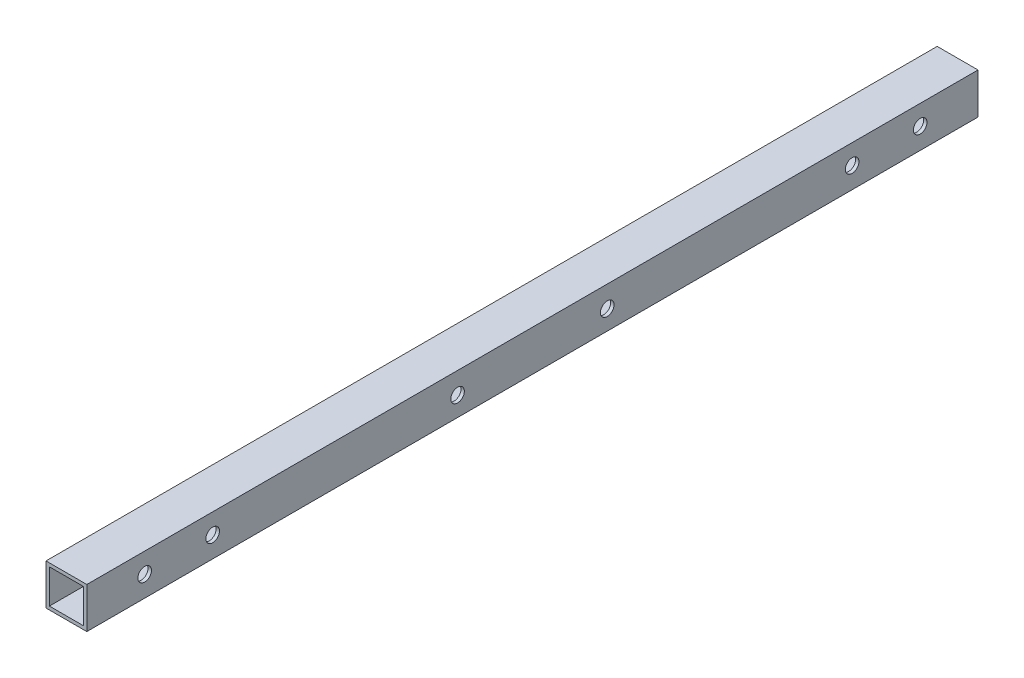
ISO-10303-21;
HEADER;
FILE_DESCRIPTION(('STEP AP214'),'2;1');
FILE_NAME('part.step','',(''),(''),'','','');
FILE_SCHEMA(('AUTOMOTIVE_DESIGN { 1 0 10303 214 1 1 1 1 }'));
ENDSEC;
DATA;
#1=APPLICATION_CONTEXT('core data for automotive mechanical design processes');
#2=APPLICATION_PROTOCOL_DEFINITION('international standard','automotive_design',2000,#1);
#3=PRODUCT_CONTEXT('',#1,'mechanical');
#4=PRODUCT('Part','Part','',(#3));
#5=PRODUCT_RELATED_PRODUCT_CATEGORY('part','',(#4));
#6=PRODUCT_DEFINITION_FORMATION('','',#4);
#7=PRODUCT_DEFINITION_CONTEXT('part definition',#1,'design');
#8=PRODUCT_DEFINITION('design','',#6,#7);
#9=PRODUCT_DEFINITION_SHAPE('','',#8);
#10=(LENGTH_UNIT() NAMED_UNIT(*) SI_UNIT(.MILLI.,.METRE.));
#11=(NAMED_UNIT(*) PLANE_ANGLE_UNIT() SI_UNIT($,.RADIAN.));
#12=(NAMED_UNIT(*) SI_UNIT($,.STERADIAN.) SOLID_ANGLE_UNIT());
#13=UNCERTAINTY_MEASURE_WITH_UNIT(LENGTH_MEASURE(1.E-05),#10,'distance_accuracy_value','');
#14=(GEOMETRIC_REPRESENTATION_CONTEXT(3) GLOBAL_UNCERTAINTY_ASSIGNED_CONTEXT((#13)) GLOBAL_UNIT_ASSIGNED_CONTEXT((#10,
#11,#12)) REPRESENTATION_CONTEXT('',''));
#15=CARTESIAN_POINT('',(0.,0.,0.));
#16=DIRECTION('',(0.,0.,1.));
#17=DIRECTION('',(1.,0.,0.));
#18=AXIS2_PLACEMENT_3D('',#15,#16,#17);
#19=CARTESIAN_POINT('',(541.017386592952,-19.05,850.806536726414));
#20=DIRECTION('',(0.,1.,0.));
#21=DIRECTION('',(0.,0.,1.));
#22=AXIS2_PLACEMENT_3D('',#19,#20,#21);
#23=PLANE('',#22);
#24=DIRECTION('',(1.,0.,0.));
#25=VECTOR('',#24,1.);
#26=CARTESIAN_POINT('',(541.017386592952,-19.05,796.924999999999));
#27=LINE('',#26,#25);
#28=CARTESIAN_POINT('',(-19.05,-19.05,796.924999999999));
#29=VERTEX_POINT('',#28);
#30=CARTESIAN_POINT('',(19.05,-19.05,796.924999999999));
#31=VERTEX_POINT('',#30);
#32=EDGE_CURVE('E11',#29,#31,#27,.T.);
#33=ORIENTED_EDGE('',*,*,#32,.F.);
#34=DIRECTION('',(0.,0.,-1.));
#35=VECTOR('',#34,1.);
#36=CARTESIAN_POINT('',(-19.05,-19.05,850.806536726414));
#37=LINE('',#36,#35);
#38=CARTESIAN_POINT('',(-19.05,-19.05,-34.9250000000007));
#39=VERTEX_POINT('',#38);
#40=EDGE_CURVE('E189',#29,#39,#37,.T.);
#41=ORIENTED_EDGE('',*,*,#40,.T.);
#42=DIRECTION('',(1.,0.,0.));
#43=VECTOR('',#42,1.);
#44=CARTESIAN_POINT('',(541.017386592952,-19.05,-34.9250000000007));
#45=LINE('',#44,#43);
#46=CARTESIAN_POINT('',(19.05,-19.05,-34.9250000000007));
#47=VERTEX_POINT('',#46);
#48=EDGE_CURVE('E182',#39,#47,#45,.T.);
#49=ORIENTED_EDGE('',*,*,#48,.T.);
#50=DIRECTION('',(0.,0.,-1.));
#51=VECTOR('',#50,1.);
#52=CARTESIAN_POINT('',(19.05,-19.05,850.806536726414));
#53=LINE('',#52,#51);
#54=EDGE_CURVE('E186',#31,#47,#53,.T.);
#55=ORIENTED_EDGE('',*,*,#54,.F.);
#56=EDGE_LOOP('',(#33,#41,#49,#55));
#57=FACE_BOUND('',#56,.T.);
#58=ADVANCED_FACE('F39',(#57),#23,.F.);
#59=CARTESIAN_POINT('',(-19.05,1.38777878078145E-13,850.806536726414));
#60=DIRECTION('',(1.,0.,0.));
#61=DIRECTION('',(0.,0.,-1.));
#62=AXIS2_PLACEMENT_3D('',#59,#60,#61);
#63=PLANE('',#62);
#64=CARTESIAN_POINT('',(-19.05,0.54169397896292,19.0499999999995));
#65=DIRECTION('',(1.,0.,0.));
#66=DIRECTION('',(0.,0.,-1.));
#67=AXIS2_PLACEMENT_3D('',#64,#65,#66);
#68=CIRCLE('',#67,6.35);
#69=CARTESIAN_POINT('',(-19.05,0.54169397896292,12.6999999999995));
#70=VERTEX_POINT('',#69);
#71=EDGE_CURVE('E257',#70,#70,#68,.T.);
#72=ORIENTED_EDGE('',*,*,#71,.T.);
#73=EDGE_LOOP('',(#72));
#74=FACE_BOUND('',#73,.T.);
#75=CARTESIAN_POINT('',(-19.05,-0.905146159063841,450.849999999999));
#76=DIRECTION('',(1.,0.,0.));
#77=DIRECTION('',(0.,0.,-1.));
#78=AXIS2_PLACEMENT_3D('',#75,#76,#77);
#79=CIRCLE('',#78,6.34999999999959);
#80=CARTESIAN_POINT('',(-19.05,-0.905146159063841,444.5));
#81=VERTEX_POINT('',#80);
#82=EDGE_CURVE('E296',#81,#81,#79,.T.);
#83=ORIENTED_EDGE('',*,*,#82,.T.);
#84=EDGE_LOOP('',(#83));
#85=FACE_BOUND('',#84,.T.);
#86=CARTESIAN_POINT('',(-19.05,0.347280154211718,679.449999999997));
#87=DIRECTION('',(1.,0.,0.));
#88=DIRECTION('',(0.,0.,-1.));
#89=AXIS2_PLACEMENT_3D('',#86,#87,#88);
#90=CIRCLE('',#89,6.34999999999994);
#91=CARTESIAN_POINT('',(-19.05,0.347280154211718,673.099999999997));
#92=VERTEX_POINT('',#91);
#93=EDGE_CURVE('E275',#92,#92,#90,.T.);
#94=ORIENTED_EDGE('',*,*,#93,.T.);
#95=EDGE_LOOP('',(#94));
#96=FACE_BOUND('',#95,.T.);
#97=CARTESIAN_POINT('',(-19.05,0.34728015421169,742.949999999997));
#98=DIRECTION('',(1.,0.,0.));
#99=DIRECTION('',(0.,0.,-1.));
#100=AXIS2_PLACEMENT_3D('',#97,#98,#99);
#101=CIRCLE('',#100,6.34999999999994);
#102=CARTESIAN_POINT('',(-19.05,0.34728015421169,736.599999999997));
#103=VERTEX_POINT('',#102);
#104=EDGE_CURVE('E276',#103,#103,#101,.T.);
#105=ORIENTED_EDGE('',*,*,#104,.T.);
#106=EDGE_LOOP('',(#105));
#107=FACE_BOUND('',#106,.T.);
#108=CARTESIAN_POINT('',(-19.05,0.541693978962934,82.5499999999995));
#109=DIRECTION('',(1.,0.,0.));
#110=DIRECTION('',(0.,0.,-1.));
#111=AXIS2_PLACEMENT_3D('',#108,#109,#110);
#112=CIRCLE('',#111,6.35);
#113=CARTESIAN_POINT('',(-19.05,0.541693978962934,76.1999999999995));
#114=VERTEX_POINT('',#113);
#115=EDGE_CURVE('E260',#114,#114,#112,.T.);
#116=ORIENTED_EDGE('',*,*,#115,.T.);
#117=EDGE_LOOP('',(#116));
#118=FACE_BOUND('',#117,.T.);
#119=CARTESIAN_POINT('',(-19.05,-0.905146159063841,311.149999999999));
#120=DIRECTION('',(1.,0.,0.));
#121=DIRECTION('',(0.,0.,-1.));
#122=AXIS2_PLACEMENT_3D('',#119,#120,#121);
#123=CIRCLE('',#122,6.34999999999953);
#124=CARTESIAN_POINT('',(-19.05,-0.905146159063841,304.8));
#125=VERTEX_POINT('',#124);
#126=EDGE_CURVE('E206',#125,#125,#123,.T.);
#127=ORIENTED_EDGE('',*,*,#126,.T.);
#128=EDGE_LOOP('',(#127));
#129=FACE_BOUND('',#128,.T.);
#130=DIRECTION('',(0.,-1.,0.));
#131=VECTOR('',#130,1.);
#132=CARTESIAN_POINT('',(-19.05,1.38777878078145E-13,796.924999999999));
#133=LINE('',#132,#131);
#134=CARTESIAN_POINT('',(-19.05,19.05,796.924999999999));
#135=VERTEX_POINT('',#134);
#136=EDGE_CURVE('E200',#135,#29,#133,.T.);
#137=ORIENTED_EDGE('',*,*,#136,.F.);
#138=DIRECTION('',(0.,0.,-1.));
#139=VECTOR('',#138,1.);
#140=CARTESIAN_POINT('',(-19.05,19.05,850.806536726414));
#141=LINE('',#140,#139);
#142=CARTESIAN_POINT('',(-19.05,19.05,-34.9250000000007));
#143=VERTEX_POINT('',#142);
#144=EDGE_CURVE('E192',#135,#143,#141,.T.);
#145=ORIENTED_EDGE('',*,*,#144,.T.);
#146=DIRECTION('',(0.,-1.,0.));
#147=VECTOR('',#146,1.);
#148=CARTESIAN_POINT('',(-19.05,1.38777878078145E-13,-34.9250000000007));
#149=LINE('',#148,#147);
#150=EDGE_CURVE('E179',#143,#39,#149,.T.);
#151=ORIENTED_EDGE('',*,*,#150,.T.);
#152=ORIENTED_EDGE('',*,*,#40,.F.);
#153=EDGE_LOOP('',(#137,#145,#151,#152));
#154=FACE_BOUND('',#153,.T.);
#155=ADVANCED_FACE('F322',(#74,#85,#96,#107,#118,#129,#154),#63,.F.);
#156=CARTESIAN_POINT('',(541.017386592952,19.05,850.806536726414));
#157=DIRECTION('',(0.,-1.,0.));
#158=DIRECTION('',(0.,0.,-1.));
#159=AXIS2_PLACEMENT_3D('',#156,#157,#158);
#160=PLANE('',#159);
#161=DIRECTION('',(-1.,0.,0.));
#162=VECTOR('',#161,1.);
#163=CARTESIAN_POINT('',(541.017386592952,19.05,796.924999999999));
#164=LINE('',#163,#162);
#165=CARTESIAN_POINT('',(19.05,19.05,796.924999999999));
#166=VERTEX_POINT('',#165);
#167=EDGE_CURVE('E247',#166,#135,#164,.T.);
#168=ORIENTED_EDGE('',*,*,#167,.F.);
#169=DIRECTION('',(0.,0.,-1.));
#170=VECTOR('',#169,1.);
#171=CARTESIAN_POINT('',(19.05,19.05,850.806536726414));
#172=LINE('',#171,#170);
#173=CARTESIAN_POINT('',(19.05,19.05,-34.9250000000007));
#174=VERTEX_POINT('',#173);
#175=EDGE_CURVE('E195',#166,#174,#172,.T.);
#176=ORIENTED_EDGE('',*,*,#175,.T.);
#177=DIRECTION('',(-1.,0.,0.));
#178=VECTOR('',#177,1.);
#179=CARTESIAN_POINT('',(541.017386592952,19.05,-34.9250000000007));
#180=LINE('',#179,#178);
#181=EDGE_CURVE('E175',#174,#143,#180,.T.);
#182=ORIENTED_EDGE('',*,*,#181,.T.);
#183=ORIENTED_EDGE('',*,*,#144,.F.);
#184=EDGE_LOOP('',(#168,#176,#182,#183));
#185=FACE_BOUND('',#184,.T.);
#186=ADVANCED_FACE('F328',(#185),#160,.F.);
#187=CARTESIAN_POINT('',(19.05,1.38777878078145E-13,850.806536726414));
#188=DIRECTION('',(-1.,0.,0.));
#189=DIRECTION('',(0.,0.,1.));
#190=AXIS2_PLACEMENT_3D('',#187,#188,#189);
#191=PLANE('',#190);
#192=CARTESIAN_POINT('',(19.05,0.54169397896292,19.0499999999995));
#193=DIRECTION('',(1.,0.,0.));
#194=DIRECTION('',(0.,0.,-1.));
#195=AXIS2_PLACEMENT_3D('',#192,#193,#194);
#196=CIRCLE('',#195,6.35);
#197=CARTESIAN_POINT('',(19.05,0.54169397896292,12.6999999999995));
#198=VERTEX_POINT('',#197);
#199=EDGE_CURVE('E255',#198,#198,#196,.T.);
#200=ORIENTED_EDGE('',*,*,#199,.F.);
#201=EDGE_LOOP('',(#200));
#202=FACE_BOUND('',#201,.T.);
#203=CARTESIAN_POINT('',(19.05,-0.905146159063841,450.849999999999));
#204=DIRECTION('',(1.,0.,0.));
#205=DIRECTION('',(0.,0.,-1.));
#206=AXIS2_PLACEMENT_3D('',#203,#204,#205);
#207=CIRCLE('',#206,6.34999999999959);
#208=CARTESIAN_POINT('',(19.05,-0.905146159063841,444.5));
#209=VERTEX_POINT('',#208);
#210=EDGE_CURVE('E282',#209,#209,#207,.T.);
#211=ORIENTED_EDGE('',*,*,#210,.F.);
#212=EDGE_LOOP('',(#211));
#213=FACE_BOUND('',#212,.T.);
#214=CARTESIAN_POINT('',(19.05,0.347280154211718,679.449999999997));
#215=DIRECTION('',(1.,0.,0.));
#216=DIRECTION('',(0.,0.,-1.));
#217=AXIS2_PLACEMENT_3D('',#214,#215,#216);
#218=CIRCLE('',#217,6.34999999999994);
#219=CARTESIAN_POINT('',(19.05,0.347280154211718,673.099999999997));
#220=VERTEX_POINT('',#219);
#221=EDGE_CURVE('E273',#220,#220,#218,.T.);
#222=ORIENTED_EDGE('',*,*,#221,.F.);
#223=EDGE_LOOP('',(#222));
#224=FACE_BOUND('',#223,.T.);
#225=CARTESIAN_POINT('',(19.05,0.34728015421169,742.949999999997));
#226=DIRECTION('',(1.,0.,0.));
#227=DIRECTION('',(0.,0.,-1.));
#228=AXIS2_PLACEMENT_3D('',#225,#226,#227);
#229=CIRCLE('',#228,6.34999999999994);
#230=CARTESIAN_POINT('',(19.05,0.34728015421169,736.599999999997));
#231=VERTEX_POINT('',#230);
#232=EDGE_CURVE('E262',#231,#231,#229,.T.);
#233=ORIENTED_EDGE('',*,*,#232,.F.);
#234=EDGE_LOOP('',(#233));
#235=FACE_BOUND('',#234,.T.);
#236=CARTESIAN_POINT('',(19.05,0.541693978962934,82.5499999999995));
#237=DIRECTION('',(1.,0.,0.));
#238=DIRECTION('',(0.,0.,-1.));
#239=AXIS2_PLACEMENT_3D('',#236,#237,#238);
#240=CIRCLE('',#239,6.35);
#241=CARTESIAN_POINT('',(19.05,0.541693978962934,76.1999999999995));
#242=VERTEX_POINT('',#241);
#243=EDGE_CURVE('E263',#242,#242,#240,.T.);
#244=ORIENTED_EDGE('',*,*,#243,.F.);
#245=EDGE_LOOP('',(#244));
#246=FACE_BOUND('',#245,.T.);
#247=CARTESIAN_POINT('',(19.05,-0.905146159063841,311.149999999999));
#248=DIRECTION('',(1.,0.,0.));
#249=DIRECTION('',(0.,0.,-1.));
#250=AXIS2_PLACEMENT_3D('',#247,#248,#249);
#251=CIRCLE('',#250,6.34999999999953);
#252=CARTESIAN_POINT('',(19.05,-0.905146159063841,304.8));
#253=VERTEX_POINT('',#252);
#254=EDGE_CURVE('E292',#253,#253,#251,.T.);
#255=ORIENTED_EDGE('',*,*,#254,.F.);
#256=EDGE_LOOP('',(#255));
#257=FACE_BOUND('',#256,.T.);
#258=DIRECTION('',(0.,1.,0.));
#259=VECTOR('',#258,1.);
#260=CARTESIAN_POINT('',(19.05,1.38777878078145E-13,796.924999999999));
#261=LINE('',#260,#259);
#262=EDGE_CURVE('E61',#31,#166,#261,.T.);
#263=ORIENTED_EDGE('',*,*,#262,.F.);
#264=ORIENTED_EDGE('',*,*,#54,.T.);
#265=DIRECTION('',(0.,1.,0.));
#266=VECTOR('',#265,1.);
#267=CARTESIAN_POINT('',(19.05,1.38777878078145E-13,-34.9250000000007));
#268=LINE('',#267,#266);
#269=EDGE_CURVE('E135',#47,#174,#268,.T.);
#270=ORIENTED_EDGE('',*,*,#269,.T.);
#271=ORIENTED_EDGE('',*,*,#175,.F.);
#272=EDGE_LOOP('',(#263,#264,#270,#271));
#273=FACE_BOUND('',#272,.T.);
#274=ADVANCED_FACE('F41',(#202,#213,#224,#235,#246,#257,#273),#191,.F.);
#275=CARTESIAN_POINT('',(0.,0.,-34.9250000000007));
#276=DIRECTION('',(0.,0.,1.));
#277=DIRECTION('',(1.,0.,0.));
#278=AXIS2_PLACEMENT_3D('',#275,#276,#277);
#279=PLANE('',#278);
#280=ORIENTED_EDGE('',*,*,#269,.F.);
#281=ORIENTED_EDGE('',*,*,#48,.F.);
#282=ORIENTED_EDGE('',*,*,#150,.F.);
#283=ORIENTED_EDGE('',*,*,#181,.F.);
#284=EDGE_LOOP('',(#280,#281,#282,#283));
#285=FACE_BOUND('',#284,.T.);
#286=DIRECTION('',(0.,-1.,0.));
#287=VECTOR('',#286,1.);
#288=CARTESIAN_POINT('',(-15.875,1.38777878078145E-13,-34.9250000000007));
#289=LINE('',#288,#287);
#290=CARTESIAN_POINT('',(-15.875,15.875,-34.9250000000007));
#291=VERTEX_POINT('',#290);
#292=CARTESIAN_POINT('',(-15.875,-15.875,-34.9250000000007));
#293=VERTEX_POINT('',#292);
#294=EDGE_CURVE('E129',#291,#293,#289,.T.);
#295=ORIENTED_EDGE('',*,*,#294,.T.);
#296=DIRECTION('',(1.,0.,0.));
#297=VECTOR('',#296,1.);
#298=CARTESIAN_POINT('',(541.017386592952,-15.875,-34.9250000000007));
#299=LINE('',#298,#297);
#300=CARTESIAN_POINT('',(15.875,-15.875,-34.9250000000007));
#301=VERTEX_POINT('',#300);
#302=EDGE_CURVE('E139',#293,#301,#299,.T.);
#303=ORIENTED_EDGE('',*,*,#302,.T.);
#304=DIRECTION('',(0.,1.,0.));
#305=VECTOR('',#304,1.);
#306=CARTESIAN_POINT('',(15.875,1.96162245086225E-13,-34.9250000000007));
#307=LINE('',#306,#305);
#308=CARTESIAN_POINT('',(15.875,15.875,-34.9250000000007));
#309=VERTEX_POINT('',#308);
#310=EDGE_CURVE('E145',#301,#309,#307,.T.);
#311=ORIENTED_EDGE('',*,*,#310,.T.);
#312=DIRECTION('',(-1.,0.,0.));
#313=VECTOR('',#312,1.);
#314=CARTESIAN_POINT('',(541.017386592952,15.8749999999999,-34.9250000000007));
#315=LINE('',#314,#313);
#316=EDGE_CURVE('E149',#309,#291,#315,.T.);
#317=ORIENTED_EDGE('',*,*,#316,.T.);
#318=EDGE_LOOP('',(#295,#303,#311,#317));
#319=FACE_BOUND('',#318,.T.);
#320=ADVANCED_FACE('F147',(#285,#319),#279,.F.);
#321=CARTESIAN_POINT('',(541.017386592952,15.8749999999999,850.806536726414));
#322=DIRECTION('',(0.,-1.,0.));
#323=DIRECTION('',(1.,0.,0.));
#324=AXIS2_PLACEMENT_3D('',#321,#322,#323);
#325=PLANE('',#324);
#326=DIRECTION('',(0.,0.,-1.));
#327=VECTOR('',#326,1.);
#328=CARTESIAN_POINT('',(15.875,15.875,850.806536726414));
#329=LINE('',#328,#327);
#330=CARTESIAN_POINT('',(15.875,15.875,796.924999999999));
#331=VERTEX_POINT('',#330);
#332=EDGE_CURVE('E167',#331,#309,#329,.T.);
#333=ORIENTED_EDGE('',*,*,#332,.F.);
#334=DIRECTION('',(-1.,0.,0.));
#335=VECTOR('',#334,1.);
#336=CARTESIAN_POINT('',(541.017386592952,15.8749999999999,796.924999999999));
#337=LINE('',#336,#335);
#338=CARTESIAN_POINT('',(-15.875,15.875,796.924999999999));
#339=VERTEX_POINT('',#338);
#340=EDGE_CURVE('E82',#331,#339,#337,.T.);
#341=ORIENTED_EDGE('',*,*,#340,.T.);
#342=DIRECTION('',(0.,0.,-1.));
#343=VECTOR('',#342,1.);
#344=CARTESIAN_POINT('',(-15.875,15.875,850.806536726414));
#345=LINE('',#344,#343);
#346=EDGE_CURVE('E164',#339,#291,#345,.T.);
#347=ORIENTED_EDGE('',*,*,#346,.T.);
#348=ORIENTED_EDGE('',*,*,#316,.F.);
#349=EDGE_LOOP('',(#333,#341,#347,#348));
#350=FACE_BOUND('',#349,.T.);
#351=ADVANCED_FACE('F307',(#350),#325,.T.);
#352=CARTESIAN_POINT('',(15.875,1.96162245086225E-13,850.806536726414));
#353=DIRECTION('',(-1.,0.,0.));
#354=DIRECTION('',(0.,-1.,0.));
#355=AXIS2_PLACEMENT_3D('',#352,#353,#354);
#356=PLANE('',#355);
#357=CARTESIAN_POINT('',(15.875,0.54169397896292,19.0499999999995));
#358=DIRECTION('',(-1.,0.,0.));
#359=DIRECTION('',(0.,-1.,0.));
#360=AXIS2_PLACEMENT_3D('',#357,#358,#359);
#361=CIRCLE('',#360,6.35);
#362=CARTESIAN_POINT('',(15.875,-5.80830602103708,19.0499999999995));
#363=VERTEX_POINT('',#362);
#364=EDGE_CURVE('E151',#363,#363,#361,.T.);
#365=ORIENTED_EDGE('',*,*,#364,.F.);
#366=EDGE_LOOP('',(#365));
#367=FACE_BOUND('',#366,.T.);
#368=CARTESIAN_POINT('',(15.875,-0.905146159063841,450.849999999999));
#369=DIRECTION('',(-1.,0.,0.));
#370=DIRECTION('',(0.,-1.,0.));
#371=AXIS2_PLACEMENT_3D('',#368,#369,#370);
#372=CIRCLE('',#371,6.34999999999959);
#373=CARTESIAN_POINT('',(15.875,-7.25514615906343,450.849999999999));
#374=VERTEX_POINT('',#373);
#375=EDGE_CURVE('E224',#374,#374,#372,.T.);
#376=ORIENTED_EDGE('',*,*,#375,.F.);
#377=EDGE_LOOP('',(#376));
#378=FACE_BOUND('',#377,.T.);
#379=CARTESIAN_POINT('',(15.875,0.347280154211718,679.449999999997));
#380=DIRECTION('',(-1.,0.,0.));
#381=DIRECTION('',(0.,-1.,0.));
#382=AXIS2_PLACEMENT_3D('',#379,#380,#381);
#383=CIRCLE('',#382,6.34999999999994);
#384=CARTESIAN_POINT('',(15.875,-6.00271984578822,679.449999999997));
#385=VERTEX_POINT('',#384);
#386=EDGE_CURVE('E220',#385,#385,#383,.T.);
#387=ORIENTED_EDGE('',*,*,#386,.F.);
#388=EDGE_LOOP('',(#387));
#389=FACE_BOUND('',#388,.T.);
#390=CARTESIAN_POINT('',(15.875,0.34728015421169,742.949999999997));
#391=DIRECTION('',(-1.,0.,0.));
#392=DIRECTION('',(0.,-1.,0.));
#393=AXIS2_PLACEMENT_3D('',#390,#391,#392);
#394=CIRCLE('',#393,6.34999999999994);
#395=CARTESIAN_POINT('',(15.875,-6.00271984578825,742.949999999997));
#396=VERTEX_POINT('',#395);
#397=EDGE_CURVE('E216',#396,#396,#394,.T.);
#398=ORIENTED_EDGE('',*,*,#397,.F.);
#399=EDGE_LOOP('',(#398));
#400=FACE_BOUND('',#399,.T.);
#401=CARTESIAN_POINT('',(15.875,0.541693978962934,82.5499999999995));
#402=DIRECTION('',(-1.,0.,0.));
#403=DIRECTION('',(0.,-1.,0.));
#404=AXIS2_PLACEMENT_3D('',#401,#402,#403);
#405=CIRCLE('',#404,6.35);
#406=CARTESIAN_POINT('',(15.875,-5.80830602103706,82.5499999999995));
#407=VERTEX_POINT('',#406);
#408=EDGE_CURVE('E211',#407,#407,#405,.T.);
#409=ORIENTED_EDGE('',*,*,#408,.F.);
#410=EDGE_LOOP('',(#409));
#411=FACE_BOUND('',#410,.T.);
#412=CARTESIAN_POINT('',(15.875,-0.905146159063841,311.149999999999));
#413=DIRECTION('',(-1.,0.,0.));
#414=DIRECTION('',(0.,-1.,0.));
#415=AXIS2_PLACEMENT_3D('',#412,#413,#414);
#416=CIRCLE('',#415,6.34999999999953);
#417=CARTESIAN_POINT('',(15.875,-7.25514615906337,311.149999999999));
#418=VERTEX_POINT('',#417);
#419=EDGE_CURVE('E205',#418,#418,#416,.T.);
#420=ORIENTED_EDGE('',*,*,#419,.F.);
#421=EDGE_LOOP('',(#420));
#422=FACE_BOUND('',#421,.T.);
#423=DIRECTION('',(0.,0.,-1.));
#424=VECTOR('',#423,1.);
#425=CARTESIAN_POINT('',(15.875,-15.875,850.806536726414));
#426=LINE('',#425,#424);
#427=CARTESIAN_POINT('',(15.875,-15.875,796.924999999999));
#428=VERTEX_POINT('',#427);
#429=EDGE_CURVE('E136',#428,#301,#426,.T.);
#430=ORIENTED_EDGE('',*,*,#429,.F.);
#431=DIRECTION('',(0.,1.,0.));
#432=VECTOR('',#431,1.);
#433=CARTESIAN_POINT('',(15.875,1.96162245086225E-13,796.924999999999));
#434=LINE('',#433,#432);
#435=EDGE_CURVE('E50',#428,#331,#434,.T.);
#436=ORIENTED_EDGE('',*,*,#435,.T.);
#437=ORIENTED_EDGE('',*,*,#332,.T.);
#438=ORIENTED_EDGE('',*,*,#310,.F.);
#439=EDGE_LOOP('',(#430,#436,#437,#438));
#440=FACE_BOUND('',#439,.T.);
#441=ADVANCED_FACE('F304',(#367,#378,#389,#400,#411,#422,#440),#356,.T.);
#442=CARTESIAN_POINT('',(541.017386592952,-15.875,850.806536726414));
#443=DIRECTION('',(0.,1.,0.));
#444=DIRECTION('',(0.,0.,1.));
#445=AXIS2_PLACEMENT_3D('',#442,#443,#444);
#446=PLANE('',#445);
#447=DIRECTION('',(0.,0.,-1.));
#448=VECTOR('',#447,1.);
#449=CARTESIAN_POINT('',(-15.875,-15.875,850.806536726414));
#450=LINE('',#449,#448);
#451=CARTESIAN_POINT('',(-15.875,-15.875,796.924999999999));
#452=VERTEX_POINT('',#451);
#453=EDGE_CURVE('E124',#452,#293,#450,.T.);
#454=ORIENTED_EDGE('',*,*,#453,.F.);
#455=DIRECTION('',(1.,0.,0.));
#456=VECTOR('',#455,1.);
#457=CARTESIAN_POINT('',(541.017386592952,-15.875,796.924999999999));
#458=LINE('',#457,#456);
#459=EDGE_CURVE('E241',#452,#428,#458,.T.);
#460=ORIENTED_EDGE('',*,*,#459,.T.);
#461=ORIENTED_EDGE('',*,*,#429,.T.);
#462=ORIENTED_EDGE('',*,*,#302,.F.);
#463=EDGE_LOOP('',(#454,#460,#461,#462));
#464=FACE_BOUND('',#463,.T.);
#465=ADVANCED_FACE('F140',(#464),#446,.T.);
#466=CARTESIAN_POINT('',(-15.875,1.38777878078145E-13,850.806536726414));
#467=DIRECTION('',(1.,0.,0.));
#468=DIRECTION('',(0.,0.,-1.));
#469=AXIS2_PLACEMENT_3D('',#466,#467,#468);
#470=PLANE('',#469);
#471=CARTESIAN_POINT('',(-15.875,0.54169397896292,19.0499999999995));
#472=DIRECTION('',(1.,0.,0.));
#473=DIRECTION('',(0.,0.,-1.));
#474=AXIS2_PLACEMENT_3D('',#471,#472,#473);
#475=CIRCLE('',#474,6.35);
#476=CARTESIAN_POINT('',(-15.875,0.54169397896292,12.6999999999995));
#477=VERTEX_POINT('',#476);
#478=EDGE_CURVE('E43',#477,#477,#475,.T.);
#479=ORIENTED_EDGE('',*,*,#478,.F.);
#480=EDGE_LOOP('',(#479));
#481=FACE_BOUND('',#480,.T.);
#482=CARTESIAN_POINT('',(-15.875,-0.905146159063841,450.849999999999));
#483=DIRECTION('',(1.,0.,0.));
#484=DIRECTION('',(0.,0.,-1.));
#485=AXIS2_PLACEMENT_3D('',#482,#483,#484);
#486=CIRCLE('',#485,6.34999999999959);
#487=CARTESIAN_POINT('',(-15.875,-0.905146159063841,444.5));
#488=VERTEX_POINT('',#487);
#489=EDGE_CURVE('E221',#488,#488,#486,.T.);
#490=ORIENTED_EDGE('',*,*,#489,.F.);
#491=EDGE_LOOP('',(#490));
#492=FACE_BOUND('',#491,.T.);
#493=CARTESIAN_POINT('',(-15.875,0.347280154211718,679.449999999997));
#494=DIRECTION('',(1.,0.,0.));
#495=DIRECTION('',(0.,0.,-1.));
#496=AXIS2_PLACEMENT_3D('',#493,#494,#495);
#497=CIRCLE('',#496,6.34999999999994);
#498=CARTESIAN_POINT('',(-15.875,0.347280154211718,673.099999999997));
#499=VERTEX_POINT('',#498);
#500=EDGE_CURVE('E217',#499,#499,#497,.T.);
#501=ORIENTED_EDGE('',*,*,#500,.F.);
#502=EDGE_LOOP('',(#501));
#503=FACE_BOUND('',#502,.T.);
#504=CARTESIAN_POINT('',(-15.875,0.34728015421169,742.949999999997));
#505=DIRECTION('',(1.,0.,0.));
#506=DIRECTION('',(0.,0.,-1.));
#507=AXIS2_PLACEMENT_3D('',#504,#505,#506);
#508=CIRCLE('',#507,6.34999999999994);
#509=CARTESIAN_POINT('',(-15.875,0.34728015421169,736.599999999997));
#510=VERTEX_POINT('',#509);
#511=EDGE_CURVE('E212',#510,#510,#508,.T.);
#512=ORIENTED_EDGE('',*,*,#511,.F.);
#513=EDGE_LOOP('',(#512));
#514=FACE_BOUND('',#513,.T.);
#515=CARTESIAN_POINT('',(-15.875,0.541693978962934,82.5499999999995));
#516=DIRECTION('',(1.,0.,0.));
#517=DIRECTION('',(0.,0.,-1.));
#518=AXIS2_PLACEMENT_3D('',#515,#516,#517);
#519=CIRCLE('',#518,6.35);
#520=CARTESIAN_POINT('',(-15.875,0.541693978962934,76.1999999999995));
#521=VERTEX_POINT('',#520);
#522=EDGE_CURVE('E207',#521,#521,#519,.T.);
#523=ORIENTED_EDGE('',*,*,#522,.F.);
#524=EDGE_LOOP('',(#523));
#525=FACE_BOUND('',#524,.T.);
#526=CARTESIAN_POINT('',(-15.875,-0.905146159063841,311.149999999999));
#527=DIRECTION('',(1.,0.,0.));
#528=DIRECTION('',(0.,0.,-1.));
#529=AXIS2_PLACEMENT_3D('',#526,#527,#528);
#530=CIRCLE('',#529,6.34999999999953);
#531=CARTESIAN_POINT('',(-15.875,-0.905146159063841,304.8));
#532=VERTEX_POINT('',#531);
#533=EDGE_CURVE('E201',#532,#532,#530,.T.);
#534=ORIENTED_EDGE('',*,*,#533,.F.);
#535=EDGE_LOOP('',(#534));
#536=FACE_BOUND('',#535,.T.);
#537=ORIENTED_EDGE('',*,*,#346,.F.);
#538=DIRECTION('',(0.,-1.,0.));
#539=VECTOR('',#538,1.);
#540=CARTESIAN_POINT('',(-15.875,1.38777878078145E-13,796.924999999999));
#541=LINE('',#540,#539);
#542=EDGE_CURVE('E131',#339,#452,#541,.T.);
#543=ORIENTED_EDGE('',*,*,#542,.T.);
#544=ORIENTED_EDGE('',*,*,#453,.T.);
#545=ORIENTED_EDGE('',*,*,#294,.F.);
#546=EDGE_LOOP('',(#537,#543,#544,#545));
#547=FACE_BOUND('',#546,.T.);
#548=ADVANCED_FACE('F127',(#481,#492,#503,#514,#525,#536,#547),#470,.T.);
#549=CARTESIAN_POINT('',(541.017386592952,3.33066907387547E-13,796.924999999999));
#550=DIRECTION('',(0.,0.,1.));
#551=DIRECTION('',(1.,0.,0.));
#552=AXIS2_PLACEMENT_3D('',#549,#550,#551);
#553=PLANE('',#552);
#554=ORIENTED_EDGE('',*,*,#340,.F.);
#555=ORIENTED_EDGE('',*,*,#435,.F.);
#556=ORIENTED_EDGE('',*,*,#459,.F.);
#557=ORIENTED_EDGE('',*,*,#542,.F.);
#558=EDGE_LOOP('',(#554,#555,#556,#557));
#559=FACE_BOUND('',#558,.T.);
#560=ORIENTED_EDGE('',*,*,#262,.T.);
#561=ORIENTED_EDGE('',*,*,#167,.T.);
#562=ORIENTED_EDGE('',*,*,#136,.T.);
#563=ORIENTED_EDGE('',*,*,#32,.T.);
#564=EDGE_LOOP('',(#560,#561,#562,#563));
#565=FACE_BOUND('',#564,.T.);
#566=ADVANCED_FACE('F311',(#559,#565),#553,.T.);
#567=CARTESIAN_POINT('',(-19.05,-0.905146159063841,311.149999999999));
#568=DIRECTION('',(1.,0.,0.));
#569=DIRECTION('',(0.,0.,-1.));
#570=AXIS2_PLACEMENT_3D('',#567,#568,#569);
#571=CYLINDRICAL_SURFACE('',#570,6.34999999999953);
#572=ORIENTED_EDGE('',*,*,#533,.T.);
#573=EDGE_LOOP('',(#572));
#574=FACE_BOUND('',#573,.T.);
#575=ORIENTED_EDGE('',*,*,#126,.F.);
#576=EDGE_LOOP('',(#575));
#577=FACE_BOUND('',#576,.T.);
#578=ADVANCED_FACE('F349',(#574,#577),#571,.F.);
#579=CARTESIAN_POINT('',(-19.05,0.541693978962934,82.5499999999995));
#580=DIRECTION('',(1.,0.,0.));
#581=DIRECTION('',(0.,0.,-1.));
#582=AXIS2_PLACEMENT_3D('',#579,#580,#581);
#583=CYLINDRICAL_SURFACE('',#582,6.35);
#584=ORIENTED_EDGE('',*,*,#522,.T.);
#585=EDGE_LOOP('',(#584));
#586=FACE_BOUND('',#585,.T.);
#587=ORIENTED_EDGE('',*,*,#115,.F.);
#588=EDGE_LOOP('',(#587));
#589=FACE_BOUND('',#588,.T.);
#590=ADVANCED_FACE('F354',(#586,#589),#583,.F.);
#591=CARTESIAN_POINT('',(-19.05,0.34728015421169,742.949999999997));
#592=DIRECTION('',(1.,0.,0.));
#593=DIRECTION('',(0.,0.,-1.));
#594=AXIS2_PLACEMENT_3D('',#591,#592,#593);
#595=CYLINDRICAL_SURFACE('',#594,6.34999999999994);
#596=ORIENTED_EDGE('',*,*,#511,.T.);
#597=EDGE_LOOP('',(#596));
#598=FACE_BOUND('',#597,.T.);
#599=ORIENTED_EDGE('',*,*,#104,.F.);
#600=EDGE_LOOP('',(#599));
#601=FACE_BOUND('',#600,.T.);
#602=ADVANCED_FACE('F368',(#598,#601),#595,.F.);
#603=CARTESIAN_POINT('',(-19.05,0.347280154211718,679.449999999997));
#604=DIRECTION('',(1.,0.,0.));
#605=DIRECTION('',(0.,0.,-1.));
#606=AXIS2_PLACEMENT_3D('',#603,#604,#605);
#607=CYLINDRICAL_SURFACE('',#606,6.34999999999994);
#608=ORIENTED_EDGE('',*,*,#500,.T.);
#609=EDGE_LOOP('',(#608));
#610=FACE_BOUND('',#609,.T.);
#611=ORIENTED_EDGE('',*,*,#93,.F.);
#612=EDGE_LOOP('',(#611));
#613=FACE_BOUND('',#612,.T.);
#614=ADVANCED_FACE('F365',(#610,#613),#607,.F.);
#615=CARTESIAN_POINT('',(-19.05,-0.905146159063841,450.849999999999));
#616=DIRECTION('',(1.,0.,0.));
#617=DIRECTION('',(0.,0.,-1.));
#618=AXIS2_PLACEMENT_3D('',#615,#616,#617);
#619=CYLINDRICAL_SURFACE('',#618,6.34999999999959);
#620=ORIENTED_EDGE('',*,*,#489,.T.);
#621=EDGE_LOOP('',(#620));
#622=FACE_BOUND('',#621,.T.);
#623=ORIENTED_EDGE('',*,*,#82,.F.);
#624=EDGE_LOOP('',(#623));
#625=FACE_BOUND('',#624,.T.);
#626=ADVANCED_FACE('F362',(#622,#625),#619,.F.);
#627=CARTESIAN_POINT('',(-19.05,0.54169397896292,19.0499999999995));
#628=DIRECTION('',(1.,0.,0.));
#629=DIRECTION('',(0.,0.,-1.));
#630=AXIS2_PLACEMENT_3D('',#627,#628,#629);
#631=CYLINDRICAL_SURFACE('',#630,6.35);
#632=ORIENTED_EDGE('',*,*,#478,.T.);
#633=EDGE_LOOP('',(#632));
#634=FACE_BOUND('',#633,.T.);
#635=ORIENTED_EDGE('',*,*,#71,.F.);
#636=EDGE_LOOP('',(#635));
#637=FACE_BOUND('',#636,.T.);
#638=ADVANCED_FACE('F359',(#634,#637),#631,.F.);
#639=ORIENTED_EDGE('',*,*,#419,.T.);
#640=EDGE_LOOP('',(#639));
#641=FACE_BOUND('',#640,.T.);
#642=ORIENTED_EDGE('',*,*,#254,.T.);
#643=EDGE_LOOP('',(#642));
#644=FACE_BOUND('',#643,.T.);
#645=ADVANCED_FACE('F301',(#641,#644),#571,.F.);
#646=ORIENTED_EDGE('',*,*,#408,.T.);
#647=EDGE_LOOP('',(#646));
#648=FACE_BOUND('',#647,.T.);
#649=ORIENTED_EDGE('',*,*,#243,.T.);
#650=EDGE_LOOP('',(#649));
#651=FACE_BOUND('',#650,.T.);
#652=ADVANCED_FACE('F377',(#648,#651),#583,.F.);
#653=ORIENTED_EDGE('',*,*,#397,.T.);
#654=EDGE_LOOP('',(#653));
#655=FACE_BOUND('',#654,.T.);
#656=ORIENTED_EDGE('',*,*,#232,.T.);
#657=EDGE_LOOP('',(#656));
#658=FACE_BOUND('',#657,.T.);
#659=ADVANCED_FACE('F380',(#655,#658),#595,.F.);
#660=ORIENTED_EDGE('',*,*,#386,.T.);
#661=EDGE_LOOP('',(#660));
#662=FACE_BOUND('',#661,.T.);
#663=ORIENTED_EDGE('',*,*,#221,.T.);
#664=EDGE_LOOP('',(#663));
#665=FACE_BOUND('',#664,.T.);
#666=ADVANCED_FACE('F370',(#662,#665),#607,.F.);
#667=ORIENTED_EDGE('',*,*,#375,.T.);
#668=EDGE_LOOP('',(#667));
#669=FACE_BOUND('',#668,.T.);
#670=ORIENTED_EDGE('',*,*,#210,.T.);
#671=EDGE_LOOP('',(#670));
#672=FACE_BOUND('',#671,.T.);
#673=ADVANCED_FACE('F373',(#669,#672),#619,.F.);
#674=ORIENTED_EDGE('',*,*,#364,.T.);
#675=EDGE_LOOP('',(#674));
#676=FACE_BOUND('',#675,.T.);
#677=ORIENTED_EDGE('',*,*,#199,.T.);
#678=EDGE_LOOP('',(#677));
#679=FACE_BOUND('',#678,.T.);
#680=ADVANCED_FACE('F364',(#676,#679),#631,.F.);
#681=CLOSED_SHELL('',(#58,#155,#186,#274,#320,#351,#441,#465,#548,#566,#578,#590,#602,#614,#626,
#638,#645,#652,#659,#666,#673,#680));
#682=MANIFOLD_SOLID_BREP('B2',#681);
#683=ADVANCED_BREP_SHAPE_REPRESENTATION('',(#18,#682),#14);
#684=SHAPE_DEFINITION_REPRESENTATION(#9,#683);
ENDSEC;
END-ISO-10303-21;
